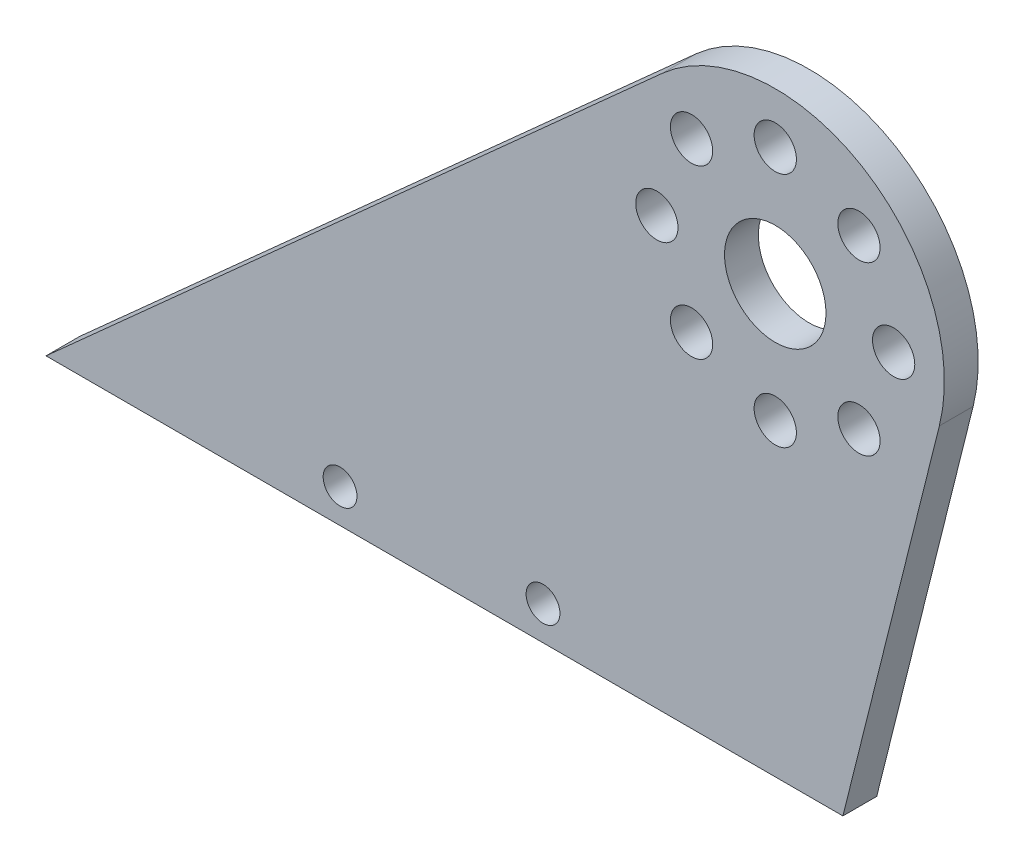
ISO-10303-21;
HEADER;
FILE_DESCRIPTION(('STEP AP214'),'2;1');
FILE_NAME('part.step','',(''),(''),'','','');
FILE_SCHEMA(('AUTOMOTIVE_DESIGN { 1 0 10303 214 1 1 1 1 }'));
ENDSEC;
DATA;
#1=APPLICATION_CONTEXT('core data for automotive mechanical design processes');
#2=APPLICATION_PROTOCOL_DEFINITION('international standard','automotive_design',2000,#1);
#3=PRODUCT_CONTEXT('',#1,'mechanical');
#4=PRODUCT('Part','Part','',(#3));
#5=PRODUCT_RELATED_PRODUCT_CATEGORY('part','',(#4));
#6=PRODUCT_DEFINITION_FORMATION('','',#4);
#7=PRODUCT_DEFINITION_CONTEXT('part definition',#1,'design');
#8=PRODUCT_DEFINITION('design','',#6,#7);
#9=PRODUCT_DEFINITION_SHAPE('','',#8);
#10=(LENGTH_UNIT() NAMED_UNIT(*) SI_UNIT(.MILLI.,.METRE.));
#11=(NAMED_UNIT(*) PLANE_ANGLE_UNIT() SI_UNIT($,.RADIAN.));
#12=(NAMED_UNIT(*) SI_UNIT($,.STERADIAN.) SOLID_ANGLE_UNIT());
#13=UNCERTAINTY_MEASURE_WITH_UNIT(LENGTH_MEASURE(1.E-05),#10,'distance_accuracy_value','');
#14=(GEOMETRIC_REPRESENTATION_CONTEXT(3) GLOBAL_UNCERTAINTY_ASSIGNED_CONTEXT((#13)) GLOBAL_UNIT_ASSIGNED_CONTEXT((#10,
#11,#12)) REPRESENTATION_CONTEXT('',''));
#15=CARTESIAN_POINT('',(0.,0.,0.));
#16=DIRECTION('',(0.,0.,1.));
#17=DIRECTION('',(1.,0.,0.));
#18=AXIS2_PLACEMENT_3D('',#15,#16,#17);
#19=CARTESIAN_POINT('',(0.,0.,2.));
#20=DIRECTION('',(0.,0.,1.));
#21=DIRECTION('',(1.,0.,0.));
#22=AXIS2_PLACEMENT_3D('',#19,#20,#21);
#23=PLANE('',#22);
#24=CARTESIAN_POINT('',(-13.7326094491651,-23.246867961275,2.));
#25=DIRECTION('',(0.,0.,1.));
#26=DIRECTION('',(1.,0.,0.));
#27=AXIS2_PLACEMENT_3D('',#24,#25,#26);
#28=CIRCLE('',#27,1.00000000000001);
#29=CARTESIAN_POINT('',(-12.7326094491651,-23.246867961275,2.));
#30=VERTEX_POINT('',#29);
#31=EDGE_CURVE('E183',#30,#30,#28,.T.);
#32=ORIENTED_EDGE('',*,*,#31,.F.);
#33=EDGE_LOOP('',(#32));
#34=FACE_BOUND('',#33,.T.);
#35=CARTESIAN_POINT('',(-6.9999999999997,-2.98427949019242E-13,2.));
#36=DIRECTION('',(0.,0.,1.));
#37=DIRECTION('',(1.,0.,0.));
#38=AXIS2_PLACEMENT_3D('',#35,#36,#37);
#39=CIRCLE('',#38,1.25000000000044);
#40=CARTESIAN_POINT('',(-5.74999999999926,-2.98427949019242E-13,2.));
#41=VERTEX_POINT('',#40);
#42=EDGE_CURVE('E195',#41,#41,#39,.T.);
#43=ORIENTED_EDGE('',*,*,#42,.F.);
#44=EDGE_LOOP('',(#43));
#45=FACE_BOUND('',#44,.T.);
#46=CARTESIAN_POINT('',(5.95141392519678E-13,-7.,2.));
#47=DIRECTION('',(0.,0.,1.));
#48=DIRECTION('',(1.,0.,0.));
#49=AXIS2_PLACEMENT_3D('',#46,#47,#48);
#50=CIRCLE('',#49,1.25000000000062);
#51=CARTESIAN_POINT('',(1.25000000000121,-7.,2.));
#52=VERTEX_POINT('',#51);
#53=EDGE_CURVE('E207',#52,#52,#50,.T.);
#54=ORIENTED_EDGE('',*,*,#53,.F.);
#55=EDGE_LOOP('',(#54));
#56=FACE_BOUND('',#55,.T.);
#57=CARTESIAN_POINT('',(7.0000000000003,2.97570696259839E-13,2.));
#58=DIRECTION('',(0.,0.,1.));
#59=DIRECTION('',(1.,0.,0.));
#60=AXIS2_PLACEMENT_3D('',#57,#58,#59);
#61=CIRCLE('',#60,1.25000000000022);
#62=CARTESIAN_POINT('',(8.25000000000052,2.97570696259839E-13,2.));
#63=VERTEX_POINT('',#62);
#64=EDGE_CURVE('E219',#63,#63,#61,.T.);
#65=ORIENTED_EDGE('',*,*,#64,.F.);
#66=EDGE_LOOP('',(#65));
#67=FACE_BOUND('',#66,.T.);
#68=CARTESIAN_POINT('',(0.,7.,2.));
#69=DIRECTION('',(0.,0.,1.));
#70=DIRECTION('',(1.,0.,0.));
#71=AXIS2_PLACEMENT_3D('',#68,#69,#70);
#72=CIRCLE('',#71,1.25);
#73=CARTESIAN_POINT('',(1.25,7.,2.));
#74=VERTEX_POINT('',#73);
#75=EDGE_CURVE('E231',#74,#74,#72,.T.);
#76=ORIENTED_EDGE('',*,*,#75,.F.);
#77=EDGE_LOOP('',(#76));
#78=FACE_BOUND('',#77,.T.);
#79=DIRECTION('',(1.,0.,0.));
#80=VECTOR('',#79,1.);
#81=CARTESIAN_POINT('',(4.00005675326525,-25.246867961275,2.));
#82=LINE('',#81,#80);
#83=CARTESIAN_POINT('',(-43.1207161756367,-25.246867961275,2.));
#84=VERTEX_POINT('',#83);
#85=CARTESIAN_POINT('',(4.00005675326525,-25.246867961275,2.));
#86=VERTEX_POINT('',#85);
#87=EDGE_CURVE('E49',#84,#86,#82,.T.);
#88=ORIENTED_EDGE('',*,*,#87,.T.);
#89=DIRECTION('',(0.24237519580308,0.970182593360352,0.));
#90=VECTOR('',#89,1.);
#91=CARTESIAN_POINT('',(4.00005675326525,-25.246867961275,2.));
#92=LINE('',#91,#90);
#93=CARTESIAN_POINT('',(9.70182593360352,-2.4237519580308,2.));
#94=VERTEX_POINT('',#93);
#95=EDGE_CURVE('E81',#86,#94,#92,.T.);
#96=ORIENTED_EDGE('',*,*,#95,.T.);
#97=CARTESIAN_POINT('',(0.,0.,2.));
#98=DIRECTION('',(0.,0.,1.));
#99=DIRECTION('',(1.,0.,0.));
#100=AXIS2_PLACEMENT_3D('',#97,#98,#99);
#101=CIRCLE('',#100,10.);
#102=CARTESIAN_POINT('',(-6.67743112180898,7.44391789405935,2.));
#103=VERTEX_POINT('',#102);
#104=EDGE_CURVE('E85',#94,#103,#101,.T.);
#105=ORIENTED_EDGE('',*,*,#104,.T.);
#106=DIRECTION('',(-0.744391789405934,-0.667743112180898,0.));
#107=VECTOR('',#106,1.);
#108=CARTESIAN_POINT('',(-6.67743112180898,7.44391789405935,2.));
#109=LINE('',#108,#107);
#110=EDGE_CURVE('E91',#103,#84,#109,.T.);
#111=ORIENTED_EDGE('',*,*,#110,.T.);
#112=EDGE_LOOP('',(#88,#96,#105,#111));
#113=FACE_BOUND('',#112,.T.);
#114=CARTESIAN_POINT('',(0.,0.,2.));
#115=DIRECTION('',(0.,0.,1.));
#116=DIRECTION('',(1.,0.,0.));
#117=AXIS2_PLACEMENT_3D('',#114,#115,#116);
#118=CIRCLE('',#117,3.);
#119=CARTESIAN_POINT('',(3.,0.,2.));
#120=VERTEX_POINT('',#119);
#121=EDGE_CURVE('E98',#120,#120,#118,.T.);
#122=ORIENTED_EDGE('',*,*,#121,.F.);
#123=EDGE_LOOP('',(#122));
#124=FACE_BOUND('',#123,.T.);
#125=CARTESIAN_POINT('',(4.94974746830592,4.94974746830604,2.));
#126=DIRECTION('',(0.,0.,1.));
#127=DIRECTION('',(1.,0.,0.));
#128=AXIS2_PLACEMENT_3D('',#125,#126,#127);
#129=CIRCLE('',#128,1.25000000000003);
#130=CARTESIAN_POINT('',(6.19974746830596,4.94974746830604,2.));
#131=VERTEX_POINT('',#130);
#132=EDGE_CURVE('E225',#131,#131,#129,.T.);
#133=ORIENTED_EDGE('',*,*,#132,.F.);
#134=EDGE_LOOP('',(#133));
#135=FACE_BOUND('',#134,.T.);
#136=CARTESIAN_POINT('',(4.94974746830634,-4.94974746830562,2.));
#137=DIRECTION('',(0.,0.,1.));
#138=DIRECTION('',(1.,0.,0.));
#139=AXIS2_PLACEMENT_3D('',#136,#137,#138);
#140=CIRCLE('',#139,1.25000000000046);
#141=CARTESIAN_POINT('',(6.1997474683068,-4.94974746830562,2.));
#142=VERTEX_POINT('',#141);
#143=EDGE_CURVE('E213',#142,#142,#140,.T.);
#144=ORIENTED_EDGE('',*,*,#143,.F.);
#145=EDGE_LOOP('',(#144));
#146=FACE_BOUND('',#145,.T.);
#147=CARTESIAN_POINT('',(-4.94974746830532,-4.94974746830604,2.));
#148=DIRECTION('',(0.,0.,1.));
#149=DIRECTION('',(1.,0.,0.));
#150=AXIS2_PLACEMENT_3D('',#147,#148,#149);
#151=CIRCLE('',#150,1.25000000000061);
#152=CARTESIAN_POINT('',(-3.69974746830472,-4.94974746830604,2.));
#153=VERTEX_POINT('',#152);
#154=EDGE_CURVE('E201',#153,#153,#151,.T.);
#155=ORIENTED_EDGE('',*,*,#154,.F.);
#156=EDGE_LOOP('',(#155));
#157=FACE_BOUND('',#156,.T.);
#158=CARTESIAN_POINT('',(-4.94974746830575,4.94974746830562,2.));
#159=DIRECTION('',(0.,0.,1.));
#160=DIRECTION('',(1.,0.,0.));
#161=AXIS2_PLACEMENT_3D('',#158,#159,#160);
#162=CIRCLE('',#161,1.25000000000023);
#163=CARTESIAN_POINT('',(-3.69974746830552,4.94974746830562,2.));
#164=VERTEX_POINT('',#163);
#165=EDGE_CURVE('E189',#164,#164,#162,.T.);
#166=ORIENTED_EDGE('',*,*,#165,.F.);
#167=EDGE_LOOP('',(#166));
#168=FACE_BOUND('',#167,.T.);
#169=CARTESIAN_POINT('',(-25.7326094491651,-23.246867961275,2.));
#170=DIRECTION('',(0.,0.,1.));
#171=DIRECTION('',(1.,0.,0.));
#172=AXIS2_PLACEMENT_3D('',#169,#170,#171);
#173=CIRCLE('',#172,0.999999999999998);
#174=CARTESIAN_POINT('',(-24.7326094491651,-23.246867961275,2.));
#175=VERTEX_POINT('',#174);
#176=EDGE_CURVE('E174',#175,#175,#173,.T.);
#177=ORIENTED_EDGE('',*,*,#176,.F.);
#178=EDGE_LOOP('',(#177));
#179=FACE_BOUND('',#178,.T.);
#180=ADVANCED_FACE('F32',(#34,#45,#56,#67,#78,#113,#124,#135,#146,#157,#168,#179),#23,.T.);
#181=CARTESIAN_POINT('',(0.,0.,0.));
#182=DIRECTION('',(0.,0.,1.));
#183=DIRECTION('',(1.,0.,0.));
#184=AXIS2_PLACEMENT_3D('',#181,#182,#183);
#185=PLANE('',#184);
#186=DIRECTION('',(0.24237519580308,0.970182593360352,0.));
#187=VECTOR('',#186,1.);
#188=CARTESIAN_POINT('',(4.00005675326525,-25.246867961275,0.));
#189=LINE('',#188,#187);
#190=CARTESIAN_POINT('',(4.00005675326525,-25.246867961275,0.));
#191=VERTEX_POINT('',#190);
#192=CARTESIAN_POINT('',(9.70182593360352,-2.4237519580308,0.));
#193=VERTEX_POINT('',#192);
#194=EDGE_CURVE('E87',#191,#193,#189,.T.);
#195=ORIENTED_EDGE('',*,*,#194,.F.);
#196=DIRECTION('',(1.,0.,0.));
#197=VECTOR('',#196,1.);
#198=CARTESIAN_POINT('',(-41.0786808733603,-25.246867961275,0.));
#199=LINE('',#198,#197);
#200=CARTESIAN_POINT('',(-43.1207161756367,-25.246867961275,0.));
#201=VERTEX_POINT('',#200);
#202=EDGE_CURVE('E74',#201,#191,#199,.T.);
#203=ORIENTED_EDGE('',*,*,#202,.F.);
#204=DIRECTION('',(-0.744391789405934,-0.667743112180898,0.));
#205=VECTOR('',#204,1.);
#206=CARTESIAN_POINT('',(-6.67743112180898,7.44391789405935,0.));
#207=LINE('',#206,#205);
#208=CARTESIAN_POINT('',(-6.67743112180898,7.44391789405935,0.));
#209=VERTEX_POINT('',#208);
#210=EDGE_CURVE('E100',#209,#201,#207,.T.);
#211=ORIENTED_EDGE('',*,*,#210,.F.);
#212=CARTESIAN_POINT('',(0.,0.,0.));
#213=DIRECTION('',(0.,0.,1.));
#214=DIRECTION('',(1.,0.,0.));
#215=AXIS2_PLACEMENT_3D('',#212,#213,#214);
#216=CIRCLE('',#215,10.);
#217=EDGE_CURVE('E67',#193,#209,#216,.T.);
#218=ORIENTED_EDGE('',*,*,#217,.F.);
#219=EDGE_LOOP('',(#195,#203,#211,#218));
#220=FACE_BOUND('',#219,.T.);
#221=CARTESIAN_POINT('',(0.,0.,0.));
#222=DIRECTION('',(0.,0.,1.));
#223=DIRECTION('',(1.,0.,0.));
#224=AXIS2_PLACEMENT_3D('',#221,#222,#223);
#225=CIRCLE('',#224,3.);
#226=CARTESIAN_POINT('',(3.,0.,0.));
#227=VERTEX_POINT('',#226);
#228=EDGE_CURVE('E234',#227,#227,#225,.T.);
#229=ORIENTED_EDGE('',*,*,#228,.T.);
#230=EDGE_LOOP('',(#229));
#231=FACE_BOUND('',#230,.T.);
#232=CARTESIAN_POINT('',(0.,7.,0.));
#233=DIRECTION('',(0.,0.,1.));
#234=DIRECTION('',(1.,0.,0.));
#235=AXIS2_PLACEMENT_3D('',#232,#233,#234);
#236=CIRCLE('',#235,1.25);
#237=CARTESIAN_POINT('',(1.25,7.,0.));
#238=VERTEX_POINT('',#237);
#239=EDGE_CURVE('E228',#238,#238,#236,.T.);
#240=ORIENTED_EDGE('',*,*,#239,.T.);
#241=EDGE_LOOP('',(#240));
#242=FACE_BOUND('',#241,.T.);
#243=CARTESIAN_POINT('',(4.94974746830592,4.94974746830604,0.));
#244=DIRECTION('',(0.,0.,1.));
#245=DIRECTION('',(1.,0.,0.));
#246=AXIS2_PLACEMENT_3D('',#243,#244,#245);
#247=CIRCLE('',#246,1.25000000000003);
#248=CARTESIAN_POINT('',(6.19974746830596,4.94974746830604,0.));
#249=VERTEX_POINT('',#248);
#250=EDGE_CURVE('E222',#249,#249,#247,.T.);
#251=ORIENTED_EDGE('',*,*,#250,.T.);
#252=EDGE_LOOP('',(#251));
#253=FACE_BOUND('',#252,.T.);
#254=CARTESIAN_POINT('',(7.0000000000003,2.97570696259839E-13,0.));
#255=DIRECTION('',(0.,0.,1.));
#256=DIRECTION('',(1.,0.,0.));
#257=AXIS2_PLACEMENT_3D('',#254,#255,#256);
#258=CIRCLE('',#257,1.25000000000022);
#259=CARTESIAN_POINT('',(8.25000000000052,2.97570696259839E-13,0.));
#260=VERTEX_POINT('',#259);
#261=EDGE_CURVE('E216',#260,#260,#258,.T.);
#262=ORIENTED_EDGE('',*,*,#261,.T.);
#263=EDGE_LOOP('',(#262));
#264=FACE_BOUND('',#263,.T.);
#265=CARTESIAN_POINT('',(4.94974746830634,-4.94974746830562,0.));
#266=DIRECTION('',(0.,0.,1.));
#267=DIRECTION('',(1.,0.,0.));
#268=AXIS2_PLACEMENT_3D('',#265,#266,#267);
#269=CIRCLE('',#268,1.25000000000046);
#270=CARTESIAN_POINT('',(6.1997474683068,-4.94974746830562,0.));
#271=VERTEX_POINT('',#270);
#272=EDGE_CURVE('E210',#271,#271,#269,.T.);
#273=ORIENTED_EDGE('',*,*,#272,.T.);
#274=EDGE_LOOP('',(#273));
#275=FACE_BOUND('',#274,.T.);
#276=CARTESIAN_POINT('',(5.95141392519678E-13,-7.,0.));
#277=DIRECTION('',(0.,0.,1.));
#278=DIRECTION('',(1.,0.,0.));
#279=AXIS2_PLACEMENT_3D('',#276,#277,#278);
#280=CIRCLE('',#279,1.25000000000062);
#281=CARTESIAN_POINT('',(1.25000000000121,-7.,0.));
#282=VERTEX_POINT('',#281);
#283=EDGE_CURVE('E204',#282,#282,#280,.T.);
#284=ORIENTED_EDGE('',*,*,#283,.T.);
#285=EDGE_LOOP('',(#284));
#286=FACE_BOUND('',#285,.T.);
#287=CARTESIAN_POINT('',(-4.94974746830532,-4.94974746830604,0.));
#288=DIRECTION('',(0.,0.,1.));
#289=DIRECTION('',(1.,0.,0.));
#290=AXIS2_PLACEMENT_3D('',#287,#288,#289);
#291=CIRCLE('',#290,1.25000000000061);
#292=CARTESIAN_POINT('',(-3.69974746830472,-4.94974746830604,0.));
#293=VERTEX_POINT('',#292);
#294=EDGE_CURVE('E198',#293,#293,#291,.T.);
#295=ORIENTED_EDGE('',*,*,#294,.T.);
#296=EDGE_LOOP('',(#295));
#297=FACE_BOUND('',#296,.T.);
#298=CARTESIAN_POINT('',(-6.9999999999997,-2.98427949019242E-13,0.));
#299=DIRECTION('',(0.,0.,1.));
#300=DIRECTION('',(1.,0.,0.));
#301=AXIS2_PLACEMENT_3D('',#298,#299,#300);
#302=CIRCLE('',#301,1.25000000000044);
#303=CARTESIAN_POINT('',(-5.74999999999926,-2.98427949019242E-13,0.));
#304=VERTEX_POINT('',#303);
#305=EDGE_CURVE('E192',#304,#304,#302,.T.);
#306=ORIENTED_EDGE('',*,*,#305,.T.);
#307=EDGE_LOOP('',(#306));
#308=FACE_BOUND('',#307,.T.);
#309=CARTESIAN_POINT('',(-4.94974746830575,4.94974746830562,0.));
#310=DIRECTION('',(0.,0.,1.));
#311=DIRECTION('',(1.,0.,0.));
#312=AXIS2_PLACEMENT_3D('',#309,#310,#311);
#313=CIRCLE('',#312,1.25000000000023);
#314=CARTESIAN_POINT('',(-3.69974746830552,4.94974746830562,0.));
#315=VERTEX_POINT('',#314);
#316=EDGE_CURVE('E186',#315,#315,#313,.T.);
#317=ORIENTED_EDGE('',*,*,#316,.T.);
#318=EDGE_LOOP('',(#317));
#319=FACE_BOUND('',#318,.T.);
#320=CARTESIAN_POINT('',(-13.7326094491651,-23.246867961275,0.));
#321=DIRECTION('',(0.,0.,1.));
#322=DIRECTION('',(1.,0.,0.));
#323=AXIS2_PLACEMENT_3D('',#320,#321,#322);
#324=CIRCLE('',#323,1.00000000000001);
#325=CARTESIAN_POINT('',(-12.7326094491651,-23.246867961275,0.));
#326=VERTEX_POINT('',#325);
#327=EDGE_CURVE('E180',#326,#326,#324,.T.);
#328=ORIENTED_EDGE('',*,*,#327,.T.);
#329=EDGE_LOOP('',(#328));
#330=FACE_BOUND('',#329,.T.);
#331=CARTESIAN_POINT('',(-25.7326094491651,-23.246867961275,0.));
#332=DIRECTION('',(0.,0.,1.));
#333=DIRECTION('',(1.,0.,0.));
#334=AXIS2_PLACEMENT_3D('',#331,#332,#333);
#335=CIRCLE('',#334,0.999999999999998);
#336=CARTESIAN_POINT('',(-24.7326094491651,-23.246867961275,0.));
#337=VERTEX_POINT('',#336);
#338=EDGE_CURVE('E177',#337,#337,#335,.T.);
#339=ORIENTED_EDGE('',*,*,#338,.T.);
#340=EDGE_LOOP('',(#339));
#341=FACE_BOUND('',#340,.T.);
#342=ADVANCED_FACE('F107',(#220,#231,#242,#253,#264,#275,#286,#297,#308,#319,#330,#341),#185,.F.);
#343=CARTESIAN_POINT('',(4.00005675326525,-25.246867961275,2.));
#344=DIRECTION('',(-0.970182593360352,0.24237519580308,0.));
#345=DIRECTION('',(-0.24237519580308,-0.970182593360352,0.));
#346=AXIS2_PLACEMENT_3D('',#343,#344,#345);
#347=PLANE('',#346);
#348=ORIENTED_EDGE('',*,*,#194,.T.);
#349=DIRECTION('',(0.,0.,-1.));
#350=VECTOR('',#349,1.);
#351=CARTESIAN_POINT('',(9.70182593360352,-2.4237519580308,2.));
#352=LINE('',#351,#350);
#353=EDGE_CURVE('E41',#94,#193,#352,.T.);
#354=ORIENTED_EDGE('',*,*,#353,.F.);
#355=ORIENTED_EDGE('',*,*,#95,.F.);
#356=DIRECTION('',(0.,0.,-1.));
#357=VECTOR('',#356,1.);
#358=CARTESIAN_POINT('',(4.00005675326525,-25.246867961275,2.));
#359=LINE('',#358,#357);
#360=EDGE_CURVE('E11',#86,#191,#359,.T.);
#361=ORIENTED_EDGE('',*,*,#360,.T.);
#362=EDGE_LOOP('',(#348,#354,#355,#361));
#363=FACE_BOUND('',#362,.T.);
#364=ADVANCED_FACE('F34',(#363),#347,.F.);
#365=CARTESIAN_POINT('',(0.,0.,2.));
#366=DIRECTION('',(0.,0.,-1.));
#367=DIRECTION('',(-1.,0.,0.));
#368=AXIS2_PLACEMENT_3D('',#365,#366,#367);
#369=CYLINDRICAL_SURFACE('',#368,10.);
#370=ORIENTED_EDGE('',*,*,#217,.T.);
#371=DIRECTION('',(0.,0.,-1.));
#372=VECTOR('',#371,1.);
#373=CARTESIAN_POINT('',(-6.67743112180898,7.44391789405935,2.));
#374=LINE('',#373,#372);
#375=EDGE_CURVE('E88',#103,#209,#374,.T.);
#376=ORIENTED_EDGE('',*,*,#375,.F.);
#377=ORIENTED_EDGE('',*,*,#104,.F.);
#378=ORIENTED_EDGE('',*,*,#353,.T.);
#379=EDGE_LOOP('',(#370,#376,#377,#378));
#380=FACE_BOUND('',#379,.T.);
#381=ADVANCED_FACE('F89',(#380),#369,.T.);
#382=CARTESIAN_POINT('',(-6.67743112180898,7.44391789405935,2.));
#383=DIRECTION('',(0.667743112180898,-0.744391789405934,0.));
#384=DIRECTION('',(0.744391789405934,0.667743112180898,0.));
#385=AXIS2_PLACEMENT_3D('',#382,#383,#384);
#386=PLANE('',#385);
#387=ORIENTED_EDGE('',*,*,#210,.T.);
#388=DIRECTION('',(0.,0.,-1.));
#389=VECTOR('',#388,1.);
#390=CARTESIAN_POINT('',(-43.1207161756367,-25.246867961275,2.));
#391=LINE('',#390,#389);
#392=EDGE_CURVE('E93',#84,#201,#391,.T.);
#393=ORIENTED_EDGE('',*,*,#392,.F.);
#394=ORIENTED_EDGE('',*,*,#110,.F.);
#395=ORIENTED_EDGE('',*,*,#375,.T.);
#396=EDGE_LOOP('',(#387,#393,#394,#395));
#397=FACE_BOUND('',#396,.T.);
#398=ADVANCED_FACE('F105',(#397),#386,.F.);
#399=CARTESIAN_POINT('',(-41.0786808733603,-25.246867961275,2.));
#400=DIRECTION('',(0.,1.,0.));
#401=DIRECTION('',(0.,0.,1.));
#402=AXIS2_PLACEMENT_3D('',#399,#400,#401);
#403=PLANE('',#402);
#404=ORIENTED_EDGE('',*,*,#202,.T.);
#405=ORIENTED_EDGE('',*,*,#360,.F.);
#406=ORIENTED_EDGE('',*,*,#87,.F.);
#407=ORIENTED_EDGE('',*,*,#392,.T.);
#408=EDGE_LOOP('',(#404,#405,#406,#407));
#409=FACE_BOUND('',#408,.T.);
#410=ADVANCED_FACE('F109',(#409),#403,.F.);
#411=CARTESIAN_POINT('',(0.,0.,2.));
#412=DIRECTION('',(0.,0.,-1.));
#413=DIRECTION('',(-1.,0.,0.));
#414=AXIS2_PLACEMENT_3D('',#411,#412,#413);
#415=CYLINDRICAL_SURFACE('',#414,3.);
#416=ORIENTED_EDGE('',*,*,#121,.T.);
#417=EDGE_LOOP('',(#416));
#418=FACE_BOUND('',#417,.T.);
#419=ORIENTED_EDGE('',*,*,#228,.F.);
#420=EDGE_LOOP('',(#419));
#421=FACE_BOUND('',#420,.T.);
#422=ADVANCED_FACE('F111',(#418,#421),#415,.F.);
#423=CARTESIAN_POINT('',(0.,7.,2.));
#424=DIRECTION('',(0.,0.,-1.));
#425=DIRECTION('',(-1.,0.,0.));
#426=AXIS2_PLACEMENT_3D('',#423,#424,#425);
#427=CYLINDRICAL_SURFACE('',#426,1.25);
#428=ORIENTED_EDGE('',*,*,#75,.T.);
#429=EDGE_LOOP('',(#428));
#430=FACE_BOUND('',#429,.T.);
#431=ORIENTED_EDGE('',*,*,#239,.F.);
#432=EDGE_LOOP('',(#431));
#433=FACE_BOUND('',#432,.T.);
#434=ADVANCED_FACE('F117',(#430,#433),#427,.F.);
#435=CARTESIAN_POINT('',(4.94974746830592,4.94974746830604,2.));
#436=DIRECTION('',(0.,0.,-1.));
#437=DIRECTION('',(-1.,0.,0.));
#438=AXIS2_PLACEMENT_3D('',#435,#436,#437);
#439=CYLINDRICAL_SURFACE('',#438,1.25000000000003);
#440=ORIENTED_EDGE('',*,*,#132,.T.);
#441=EDGE_LOOP('',(#440));
#442=FACE_BOUND('',#441,.T.);
#443=ORIENTED_EDGE('',*,*,#250,.F.);
#444=EDGE_LOOP('',(#443));
#445=FACE_BOUND('',#444,.T.);
#446=ADVANCED_FACE('F133',(#442,#445),#439,.F.);
#447=CARTESIAN_POINT('',(7.0000000000003,2.97570696259839E-13,2.));
#448=DIRECTION('',(0.,0.,-1.));
#449=DIRECTION('',(-1.,0.,0.));
#450=AXIS2_PLACEMENT_3D('',#447,#448,#449);
#451=CYLINDRICAL_SURFACE('',#450,1.25000000000022);
#452=ORIENTED_EDGE('',*,*,#64,.T.);
#453=EDGE_LOOP('',(#452));
#454=FACE_BOUND('',#453,.T.);
#455=ORIENTED_EDGE('',*,*,#261,.F.);
#456=EDGE_LOOP('',(#455));
#457=FACE_BOUND('',#456,.T.);
#458=ADVANCED_FACE('F137',(#454,#457),#451,.F.);
#459=CARTESIAN_POINT('',(4.94974746830634,-4.94974746830562,2.));
#460=DIRECTION('',(0.,0.,-1.));
#461=DIRECTION('',(-1.,0.,0.));
#462=AXIS2_PLACEMENT_3D('',#459,#460,#461);
#463=CYLINDRICAL_SURFACE('',#462,1.25000000000046);
#464=ORIENTED_EDGE('',*,*,#143,.T.);
#465=EDGE_LOOP('',(#464));
#466=FACE_BOUND('',#465,.T.);
#467=ORIENTED_EDGE('',*,*,#272,.F.);
#468=EDGE_LOOP('',(#467));
#469=FACE_BOUND('',#468,.T.);
#470=ADVANCED_FACE('F141',(#466,#469),#463,.F.);
#471=CARTESIAN_POINT('',(5.95141392519678E-13,-7.,2.));
#472=DIRECTION('',(0.,0.,-1.));
#473=DIRECTION('',(-1.,0.,0.));
#474=AXIS2_PLACEMENT_3D('',#471,#472,#473);
#475=CYLINDRICAL_SURFACE('',#474,1.25000000000062);
#476=ORIENTED_EDGE('',*,*,#53,.T.);
#477=EDGE_LOOP('',(#476));
#478=FACE_BOUND('',#477,.T.);
#479=ORIENTED_EDGE('',*,*,#283,.F.);
#480=EDGE_LOOP('',(#479));
#481=FACE_BOUND('',#480,.T.);
#482=ADVANCED_FACE('F145',(#478,#481),#475,.F.);
#483=CARTESIAN_POINT('',(-4.94974746830532,-4.94974746830604,2.));
#484=DIRECTION('',(0.,0.,-1.));
#485=DIRECTION('',(-1.,0.,0.));
#486=AXIS2_PLACEMENT_3D('',#483,#484,#485);
#487=CYLINDRICAL_SURFACE('',#486,1.25000000000061);
#488=ORIENTED_EDGE('',*,*,#154,.T.);
#489=EDGE_LOOP('',(#488));
#490=FACE_BOUND('',#489,.T.);
#491=ORIENTED_EDGE('',*,*,#294,.F.);
#492=EDGE_LOOP('',(#491));
#493=FACE_BOUND('',#492,.T.);
#494=ADVANCED_FACE('F149',(#490,#493),#487,.F.);
#495=CARTESIAN_POINT('',(-6.9999999999997,-2.98427949019242E-13,2.));
#496=DIRECTION('',(0.,0.,-1.));
#497=DIRECTION('',(-1.,0.,0.));
#498=AXIS2_PLACEMENT_3D('',#495,#496,#497);
#499=CYLINDRICAL_SURFACE('',#498,1.25000000000044);
#500=ORIENTED_EDGE('',*,*,#42,.T.);
#501=EDGE_LOOP('',(#500));
#502=FACE_BOUND('',#501,.T.);
#503=ORIENTED_EDGE('',*,*,#305,.F.);
#504=EDGE_LOOP('',(#503));
#505=FACE_BOUND('',#504,.T.);
#506=ADVANCED_FACE('F153',(#502,#505),#499,.F.);
#507=CARTESIAN_POINT('',(-4.94974746830575,4.94974746830562,2.));
#508=DIRECTION('',(0.,0.,-1.));
#509=DIRECTION('',(-1.,0.,0.));
#510=AXIS2_PLACEMENT_3D('',#507,#508,#509);
#511=CYLINDRICAL_SURFACE('',#510,1.25000000000023);
#512=ORIENTED_EDGE('',*,*,#165,.T.);
#513=EDGE_LOOP('',(#512));
#514=FACE_BOUND('',#513,.T.);
#515=ORIENTED_EDGE('',*,*,#316,.F.);
#516=EDGE_LOOP('',(#515));
#517=FACE_BOUND('',#516,.T.);
#518=ADVANCED_FACE('F157',(#514,#517),#511,.F.);
#519=CARTESIAN_POINT('',(-13.7326094491651,-23.246867961275,2.));
#520=DIRECTION('',(0.,0.,-1.));
#521=DIRECTION('',(-1.,0.,0.));
#522=AXIS2_PLACEMENT_3D('',#519,#520,#521);
#523=CYLINDRICAL_SURFACE('',#522,1.00000000000001);
#524=ORIENTED_EDGE('',*,*,#31,.T.);
#525=EDGE_LOOP('',(#524));
#526=FACE_BOUND('',#525,.T.);
#527=ORIENTED_EDGE('',*,*,#327,.F.);
#528=EDGE_LOOP('',(#527));
#529=FACE_BOUND('',#528,.T.);
#530=ADVANCED_FACE('F161',(#526,#529),#523,.F.);
#531=CARTESIAN_POINT('',(-25.7326094491651,-23.246867961275,2.));
#532=DIRECTION('',(0.,0.,-1.));
#533=DIRECTION('',(-1.,0.,0.));
#534=AXIS2_PLACEMENT_3D('',#531,#532,#533);
#535=CYLINDRICAL_SURFACE('',#534,0.999999999999998);
#536=ORIENTED_EDGE('',*,*,#176,.T.);
#537=EDGE_LOOP('',(#536));
#538=FACE_BOUND('',#537,.T.);
#539=ORIENTED_EDGE('',*,*,#338,.F.);
#540=EDGE_LOOP('',(#539));
#541=FACE_BOUND('',#540,.T.);
#542=ADVANCED_FACE('F165',(#538,#541),#535,.F.);
#543=CLOSED_SHELL('',(#180,#342,#364,#381,#398,#410,#422,#434,#446,#458,#470,#482,#494,#506,
#518,#530,#542));
#544=MANIFOLD_SOLID_BREP('B2',#543);
#545=ADVANCED_BREP_SHAPE_REPRESENTATION('',(#18,#544),#14);
#546=SHAPE_DEFINITION_REPRESENTATION(#9,#545);
ENDSEC;
END-ISO-10303-21;
